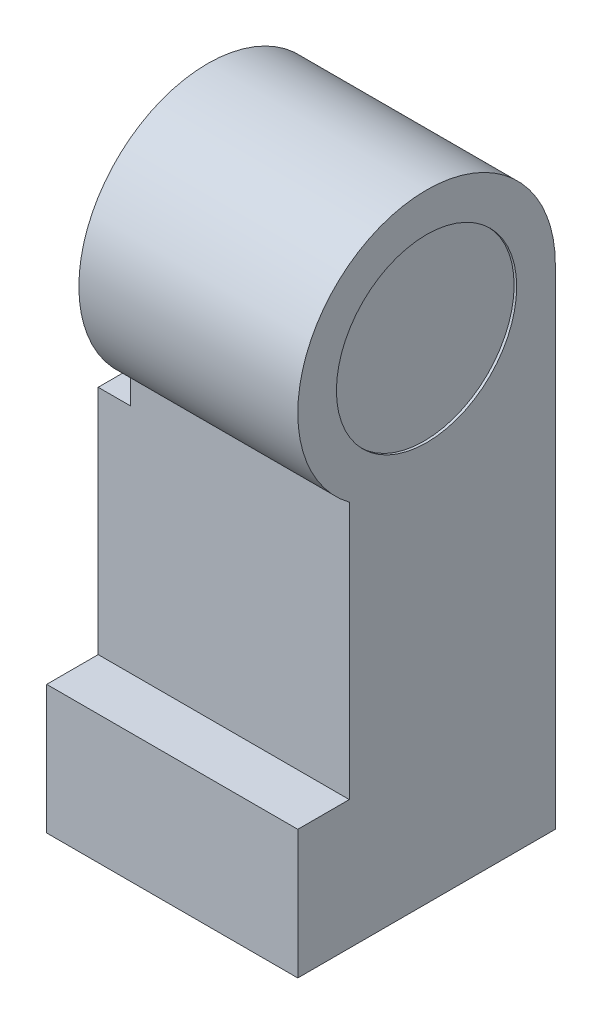
ISO-10303-21;
HEADER;
FILE_DESCRIPTION(('STEP AP214'),'2;1');
FILE_NAME('part.step','',(''),(''),'','','');
FILE_SCHEMA(('AUTOMOTIVE_DESIGN { 1 0 10303 214 1 1 1 1 }'));
ENDSEC;
DATA;
#1=APPLICATION_CONTEXT('core data for automotive mechanical design processes');
#2=APPLICATION_PROTOCOL_DEFINITION('international standard','automotive_design',2000,#1);
#3=PRODUCT_CONTEXT('',#1,'mechanical');
#4=PRODUCT('Part','Part','',(#3));
#5=PRODUCT_RELATED_PRODUCT_CATEGORY('part','',(#4));
#6=PRODUCT_DEFINITION_FORMATION('','',#4);
#7=PRODUCT_DEFINITION_CONTEXT('part definition',#1,'design');
#8=PRODUCT_DEFINITION('design','',#6,#7);
#9=PRODUCT_DEFINITION_SHAPE('','',#8);
#10=(LENGTH_UNIT() NAMED_UNIT(*) SI_UNIT(.MILLI.,.METRE.));
#11=(NAMED_UNIT(*) PLANE_ANGLE_UNIT() SI_UNIT($,.RADIAN.));
#12=(NAMED_UNIT(*) SI_UNIT($,.STERADIAN.) SOLID_ANGLE_UNIT());
#13=UNCERTAINTY_MEASURE_WITH_UNIT(LENGTH_MEASURE(1.E-05),#10,'distance_accuracy_value','');
#14=(GEOMETRIC_REPRESENTATION_CONTEXT(3) GLOBAL_UNCERTAINTY_ASSIGNED_CONTEXT((#13)) GLOBAL_UNIT_ASSIGNED_CONTEXT((#10,
#11,#12)) REPRESENTATION_CONTEXT('',''));
#15=CARTESIAN_POINT('',(0.,0.,0.));
#16=DIRECTION('',(0.,0.,1.));
#17=DIRECTION('',(1.,0.,0.));
#18=AXIS2_PLACEMENT_3D('',#15,#16,#17);
#19=CARTESIAN_POINT('',(-5.40048653563176,-1.49615044863682,-4.47761072313333));
#20=DIRECTION('',(0.,-1.,0.));
#21=DIRECTION('',(0.,0.,-1.));
#22=AXIS2_PLACEMENT_3D('',#19,#20,#21);
#23=PLANE('',#22);
#24=DIRECTION('',(0.,0.,-1.));
#25=VECTOR('',#24,1.);
#26=CARTESIAN_POINT('',(-4.90048653563176,-1.49615044863682,-4.47761072313333));
#27=LINE('',#26,#25);
#28=CARTESIAN_POINT('',(-4.90048653563176,-1.49615044863682,15.5223892768667));
#29=VERTEX_POINT('',#28);
#30=CARTESIAN_POINT('',(-4.90048653563176,-1.49615044863681,11.5223892768667));
#31=VERTEX_POINT('',#30);
#32=EDGE_CURVE('E194',#29,#31,#27,.T.);
#33=ORIENTED_EDGE('',*,*,#32,.F.);
#34=DIRECTION('',(1.,0.,0.));
#35=VECTOR('',#34,1.);
#36=CARTESIAN_POINT('',(-5.40048653563176,-1.49615044863682,15.5223892768667));
#37=LINE('',#36,#35);
#38=CARTESIAN_POINT('',(14.5995134643682,-1.49615044863682,15.5223892768667));
#39=VERTEX_POINT('',#38);
#40=EDGE_CURVE('E177',#29,#39,#37,.T.);
#41=ORIENTED_EDGE('',*,*,#40,.T.);
#42=DIRECTION('',(0.,0.,-1.));
#43=VECTOR('',#42,1.);
#44=CARTESIAN_POINT('',(14.5995134643682,-1.49615044863682,15.5223892768667));
#45=LINE('',#44,#43);
#46=CARTESIAN_POINT('',(14.5995134643682,-1.49615044863682,11.5223892768667));
#47=VERTEX_POINT('',#46);
#48=EDGE_CURVE('E168',#39,#47,#45,.T.);
#49=ORIENTED_EDGE('',*,*,#48,.T.);
#50=DIRECTION('',(1.,0.,0.));
#51=VECTOR('',#50,1.);
#52=CARTESIAN_POINT('',(-5.40048653563176,-1.49615044863682,11.5223892768667));
#53=LINE('',#52,#51);
#54=EDGE_CURVE('E41',#31,#47,#53,.T.);
#55=ORIENTED_EDGE('',*,*,#54,.F.);
#56=EDGE_LOOP('',(#33,#41,#49,#55));
#57=FACE_BOUND('',#56,.T.);
#58=ADVANCED_FACE('F37',(#57),#23,.F.);
#59=CARTESIAN_POINT('',(-5.40048653563176,-1.49615044863682,-4.47761072313333));
#60=DIRECTION('',(0.,0.,1.));
#61=DIRECTION('',(1.,0.,0.));
#62=AXIS2_PLACEMENT_3D('',#59,#60,#61);
#63=PLANE('',#62);
#64=DIRECTION('',(0.,-1.,0.));
#65=VECTOR('',#64,1.);
#66=CARTESIAN_POINT('',(-4.90048653563176,-11.4961504486368,-4.47761072313333));
#67=LINE('',#66,#65);
#68=CARTESIAN_POINT('',(-4.90048653563176,20.7072528486993,-4.47761072313333));
#69=VERTEX_POINT('',#68);
#70=CARTESIAN_POINT('',(-4.90048653563176,-11.4961504486368,-4.47761072313333));
#71=VERTEX_POINT('',#70);
#72=EDGE_CURVE('E143',#69,#71,#67,.T.);
#73=ORIENTED_EDGE('',*,*,#72,.F.);
#74=DIRECTION('',(-1.,0.,0.));
#75=VECTOR('',#74,1.);
#76=CARTESIAN_POINT('',(-2.40048653563176,20.7072528486993,-4.47761072313333));
#77=LINE('',#76,#75);
#78=CARTESIAN_POINT('',(-2.40048653563176,20.7072528486993,-4.47761072313333));
#79=VERTEX_POINT('',#78);
#80=EDGE_CURVE('E243',#79,#69,#77,.T.);
#81=ORIENTED_EDGE('',*,*,#80,.F.);
#82=DIRECTION('',(0.,-1.,0.));
#83=VECTOR('',#82,1.);
#84=CARTESIAN_POINT('',(-2.40048653563176,20.7072528486993,-4.47761072313333));
#85=LINE('',#84,#83);
#86=CARTESIAN_POINT('',(-2.40048653563176,26.5038495513632,-4.47761072313333));
#87=VERTEX_POINT('',#86);
#88=EDGE_CURVE('E230',#87,#79,#85,.T.);
#89=ORIENTED_EDGE('',*,*,#88,.F.);
#90=DIRECTION('',(-1.,0.,0.));
#91=VECTOR('',#90,1.);
#92=CARTESIAN_POINT('',(-5.40048653563176,26.5038495513632,-4.47761072313333));
#93=LINE('',#92,#91);
#94=CARTESIAN_POINT('',(14.5995134643682,26.5038495513632,-4.47761072313333));
#95=VERTEX_POINT('',#94);
#96=EDGE_CURVE('E205',#95,#87,#93,.T.);
#97=ORIENTED_EDGE('',*,*,#96,.F.);
#98=DIRECTION('',(0.,-1.,0.));
#99=VECTOR('',#98,1.);
#100=CARTESIAN_POINT('',(14.5995134643682,-1.49615044863682,-4.47761072313333));
#101=LINE('',#100,#99);
#102=CARTESIAN_POINT('',(14.5995134643682,-11.4961504486368,-4.47761072313333));
#103=VERTEX_POINT('',#102);
#104=EDGE_CURVE('E164',#95,#103,#101,.T.);
#105=ORIENTED_EDGE('',*,*,#104,.T.);
#106=DIRECTION('',(-1.,0.,0.));
#107=VECTOR('',#106,1.);
#108=CARTESIAN_POINT('',(-5.40048653563176,-11.4961504486368,-4.47761072313333));
#109=LINE('',#108,#107);
#110=EDGE_CURVE('E158',#103,#71,#109,.T.);
#111=ORIENTED_EDGE('',*,*,#110,.T.);
#112=EDGE_LOOP('',(#73,#81,#89,#97,#105,#111));
#113=FACE_BOUND('',#112,.T.);
#114=ADVANCED_FACE('F162',(#113),#63,.F.);
#115=CARTESIAN_POINT('',(-5.40048653563176,-1.49615044863682,15.5223892768667));
#116=DIRECTION('',(0.,0.,-1.));
#117=DIRECTION('',(-1.,0.,0.));
#118=AXIS2_PLACEMENT_3D('',#115,#116,#117);
#119=PLANE('',#118);
#120=DIRECTION('',(0.,1.,0.));
#121=VECTOR('',#120,1.);
#122=CARTESIAN_POINT('',(-4.90048653563176,-11.4961504486368,15.5223892768667));
#123=LINE('',#122,#121);
#124=CARTESIAN_POINT('',(-4.90048653563176,-11.4961504486368,15.5223892768667));
#125=VERTEX_POINT('',#124);
#126=EDGE_CURVE('E152',#125,#29,#123,.T.);
#127=ORIENTED_EDGE('',*,*,#126,.F.);
#128=DIRECTION('',(1.,0.,0.));
#129=VECTOR('',#128,1.);
#130=CARTESIAN_POINT('',(-5.40048653563176,-11.4961504486368,15.5223892768667));
#131=LINE('',#130,#129);
#132=CARTESIAN_POINT('',(14.5995134643682,-11.4961504486368,15.5223892768667));
#133=VERTEX_POINT('',#132);
#134=EDGE_CURVE('E160',#125,#133,#131,.T.);
#135=ORIENTED_EDGE('',*,*,#134,.T.);
#136=DIRECTION('',(0.,-1.,0.));
#137=VECTOR('',#136,1.);
#138=CARTESIAN_POINT('',(14.5995134643682,-1.49615044863682,15.5223892768667));
#139=LINE('',#138,#137);
#140=EDGE_CURVE('E174',#39,#133,#139,.T.);
#141=ORIENTED_EDGE('',*,*,#140,.F.);
#142=ORIENTED_EDGE('',*,*,#40,.F.);
#143=EDGE_LOOP('',(#127,#135,#141,#142));
#144=FACE_BOUND('',#143,.T.);
#145=ADVANCED_FACE('F196',(#144),#119,.F.);
#146=CARTESIAN_POINT('',(-5.40048653563176,-11.4961504486368,-4.47761072313333));
#147=DIRECTION('',(0.,-1.,0.));
#148=DIRECTION('',(0.,0.,-1.));
#149=AXIS2_PLACEMENT_3D('',#146,#147,#148);
#150=PLANE('',#149);
#151=DIRECTION('',(0.,0.,-1.));
#152=VECTOR('',#151,1.);
#153=CARTESIAN_POINT('',(-1.40048653563176,-11.4961504486368,11.5223892768667));
#154=LINE('',#153,#152);
#155=CARTESIAN_POINT('',(-1.40048653563176,-11.4961504486368,11.5223892768667));
#156=VERTEX_POINT('',#155);
#157=CARTESIAN_POINT('',(-1.40048653563176,-11.4961504486368,-0.477610723133327));
#158=VERTEX_POINT('',#157);
#159=EDGE_CURVE('E61',#156,#158,#154,.T.);
#160=ORIENTED_EDGE('',*,*,#159,.F.);
#161=DIRECTION('',(-1.,0.,0.));
#162=VECTOR('',#161,1.);
#163=CARTESIAN_POINT('',(-1.40048653563176,-11.4961504486368,11.5223892768667));
#164=LINE('',#163,#162);
#165=CARTESIAN_POINT('',(10.5995134643682,-11.4961504486368,11.5223892768667));
#166=VERTEX_POINT('',#165);
#167=EDGE_CURVE('E278',#166,#156,#164,.T.);
#168=ORIENTED_EDGE('',*,*,#167,.F.);
#169=DIRECTION('',(0.,0.,1.));
#170=VECTOR('',#169,1.);
#171=CARTESIAN_POINT('',(10.5995134643682,-11.4961504486368,11.5223892768667));
#172=LINE('',#171,#170);
#173=CARTESIAN_POINT('',(10.5995134643682,-11.4961504486368,-0.477610723133327));
#174=VERTEX_POINT('',#173);
#175=EDGE_CURVE('E292',#174,#166,#172,.T.);
#176=ORIENTED_EDGE('',*,*,#175,.F.);
#177=DIRECTION('',(1.,0.,0.));
#178=VECTOR('',#177,1.);
#179=CARTESIAN_POINT('',(-1.40048653563176,-11.4961504486368,-0.477610723133327));
#180=LINE('',#179,#178);
#181=EDGE_CURVE('E289',#158,#174,#180,.T.);
#182=ORIENTED_EDGE('',*,*,#181,.F.);
#183=EDGE_LOOP('',(#160,#168,#176,#182));
#184=FACE_BOUND('',#183,.T.);
#185=ORIENTED_EDGE('',*,*,#134,.F.);
#186=DIRECTION('',(0.,0.,1.));
#187=VECTOR('',#186,1.);
#188=CARTESIAN_POINT('',(-4.90048653563176,-11.4961504486368,15.5223892768667));
#189=LINE('',#188,#187);
#190=EDGE_CURVE('E146',#71,#125,#189,.T.);
#191=ORIENTED_EDGE('',*,*,#190,.F.);
#192=ORIENTED_EDGE('',*,*,#110,.F.);
#193=DIRECTION('',(0.,0.,-1.));
#194=VECTOR('',#193,1.);
#195=CARTESIAN_POINT('',(14.5995134643682,-11.4961504486368,15.5223892768667));
#196=LINE('',#195,#194);
#197=EDGE_CURVE('E166',#133,#103,#196,.T.);
#198=ORIENTED_EDGE('',*,*,#197,.F.);
#199=EDGE_LOOP('',(#185,#191,#192,#198));
#200=FACE_BOUND('',#199,.T.);
#201=ADVANCED_FACE('F156',(#184,#200),#150,.T.);
#202=CARTESIAN_POINT('',(-5.40048653563176,26.5038495513632,11.5223892768667));
#203=DIRECTION('',(0.,0.,-1.));
#204=DIRECTION('',(-1.,0.,0.));
#205=AXIS2_PLACEMENT_3D('',#202,#203,#204);
#206=PLANE('',#205);
#207=DIRECTION('',(0.,1.,0.));
#208=VECTOR('',#207,1.);
#209=CARTESIAN_POINT('',(-4.90048653563176,26.5038495513632,11.5223892768667));
#210=LINE('',#209,#208);
#211=CARTESIAN_POINT('',(-4.90048653563176,16.4838495513632,11.5223892768667));
#212=VERTEX_POINT('',#211);
#213=EDGE_CURVE('E213',#31,#212,#210,.T.);
#214=ORIENTED_EDGE('',*,*,#213,.F.);
#215=ORIENTED_EDGE('',*,*,#54,.T.);
#216=DIRECTION('',(0.,-1.,0.));
#217=VECTOR('',#216,1.);
#218=CARTESIAN_POINT('',(14.5995134643682,26.5038495513632,11.5223892768667));
#219=LINE('',#218,#217);
#220=CARTESIAN_POINT('',(14.5995134643682,18.5038495513632,11.5223892768667));
#221=VERTEX_POINT('',#220);
#222=EDGE_CURVE('E170',#221,#47,#219,.T.);
#223=ORIENTED_EDGE('',*,*,#222,.F.);
#224=DIRECTION('',(-1.,0.,0.));
#225=VECTOR('',#224,1.);
#226=CARTESIAN_POINT('',(14.5995134643682,18.5038495513632,11.5223892768667));
#227=LINE('',#226,#225);
#228=CARTESIAN_POINT('',(-2.40048653563176,18.5038495513632,11.5223892768667));
#229=VERTEX_POINT('',#228);
#230=EDGE_CURVE('E254',#221,#229,#227,.T.);
#231=ORIENTED_EDGE('',*,*,#230,.T.);
#232=DIRECTION('',(0.,-1.,0.));
#233=VECTOR('',#232,1.);
#234=CARTESIAN_POINT('',(-2.40048653563176,26.5038495513632,11.5223892768667));
#235=LINE('',#234,#233);
#236=CARTESIAN_POINT('',(-2.40048653563176,16.4838495513632,11.5223892768667));
#237=VERTEX_POINT('',#236);
#238=EDGE_CURVE('E215',#229,#237,#235,.T.);
#239=ORIENTED_EDGE('',*,*,#238,.T.);
#240=DIRECTION('',(-1.,0.,0.));
#241=VECTOR('',#240,1.);
#242=CARTESIAN_POINT('',(-5.40048653563176,16.4838495513632,11.5223892768667));
#243=LINE('',#242,#241);
#244=EDGE_CURVE('E47',#237,#212,#243,.T.);
#245=ORIENTED_EDGE('',*,*,#244,.T.);
#246=EDGE_LOOP('',(#214,#215,#223,#231,#239,#245));
#247=FACE_BOUND('',#246,.T.);
#248=ADVANCED_FACE('F212',(#247),#206,.F.);
#249=CARTESIAN_POINT('',(-2.40048653563176,16.4838495513632,5.52238927686668));
#250=DIRECTION('',(0.,-1.,0.));
#251=DIRECTION('',(0.,0.,-1.));
#252=AXIS2_PLACEMENT_3D('',#249,#250,#251);
#253=PLANE('',#252);
#254=DIRECTION('',(0.,0.,-1.));
#255=VECTOR('',#254,1.);
#256=CARTESIAN_POINT('',(-4.90048653563176,16.4838495513632,5.52238927686668));
#257=LINE('',#256,#255);
#258=CARTESIAN_POINT('',(-4.90048653563176,16.4838495513632,5.52238927686668));
#259=VERTEX_POINT('',#258);
#260=EDGE_CURVE('E224',#212,#259,#257,.T.);
#261=ORIENTED_EDGE('',*,*,#260,.F.);
#262=ORIENTED_EDGE('',*,*,#244,.F.);
#263=DIRECTION('',(0.,0.,1.));
#264=VECTOR('',#263,1.);
#265=CARTESIAN_POINT('',(-2.40048653563176,16.4838495513632,5.52238927686668));
#266=LINE('',#265,#264);
#267=CARTESIAN_POINT('',(-2.40048653563176,16.4838495513632,5.52238927686668));
#268=VERTEX_POINT('',#267);
#269=EDGE_CURVE('E222',#268,#237,#266,.T.);
#270=ORIENTED_EDGE('',*,*,#269,.F.);
#271=DIRECTION('',(-1.,0.,0.));
#272=VECTOR('',#271,1.);
#273=CARTESIAN_POINT('',(-2.40048653563176,16.4838495513632,5.52238927686668));
#274=LINE('',#273,#272);
#275=EDGE_CURVE('E239',#268,#259,#274,.T.);
#276=ORIENTED_EDGE('',*,*,#275,.T.);
#277=EDGE_LOOP('',(#261,#262,#270,#276));
#278=FACE_BOUND('',#277,.T.);
#279=ADVANCED_FACE('F220',(#278),#253,.F.);
#280=CARTESIAN_POINT('',(-2.40048653563176,26.5038495513632,5.52238927686667));
#281=DIRECTION('',(-1.,0.,0.));
#282=DIRECTION('',(0.,0.,1.));
#283=AXIS2_PLACEMENT_3D('',#280,#281,#282);
#284=CYLINDRICAL_SURFACE('',#283,10.02);
#285=CARTESIAN_POINT('',(-4.90048653563176,26.5038495513632,5.52238927686667));
#286=DIRECTION('',(-1.,0.,0.));
#287=DIRECTION('',(0.,0.,1.));
#288=AXIS2_PLACEMENT_3D('',#285,#286,#287);
#289=CIRCLE('',#288,10.02);
#290=CARTESIAN_POINT('',(-4.90048653563176,17.8262750054431,0.512389276866731));
#291=VERTEX_POINT('',#290);
#292=EDGE_CURVE('E53',#259,#291,#289,.F.);
#293=ORIENTED_EDGE('',*,*,#292,.F.);
#294=ORIENTED_EDGE('',*,*,#275,.F.);
#295=CARTESIAN_POINT('',(-2.40048653563176,26.5038495513632,5.52238927686667));
#296=DIRECTION('',(-1.,0.,0.));
#297=DIRECTION('',(0.,0.,-1.));
#298=AXIS2_PLACEMENT_3D('',#295,#296,#297);
#299=CIRCLE('',#298,10.02);
#300=CARTESIAN_POINT('',(-2.40048653563176,17.8262750054431,0.51238927686673));
#301=VERTEX_POINT('',#300);
#302=EDGE_CURVE('E229',#301,#268,#299,.T.);
#303=ORIENTED_EDGE('',*,*,#302,.F.);
#304=DIRECTION('',(-1.,0.,0.));
#305=VECTOR('',#304,1.);
#306=CARTESIAN_POINT('',(-2.40048653563176,17.8262750054431,0.51238927686673));
#307=LINE('',#306,#305);
#308=EDGE_CURVE('E240',#301,#291,#307,.T.);
#309=ORIENTED_EDGE('',*,*,#308,.T.);
#310=EDGE_LOOP('',(#293,#294,#303,#309));
#311=FACE_BOUND('',#310,.T.);
#312=ADVANCED_FACE('F262',(#311),#284,.F.);
#313=CARTESIAN_POINT('',(-2.40048653563176,17.8262750054431,0.51238927686673));
#314=DIRECTION('',(0.,-0.866025403784442,-0.499999999999994));
#315=DIRECTION('',(0.,0.499999999999994,-0.866025403784442));
#316=AXIS2_PLACEMENT_3D('',#313,#314,#315);
#317=PLANE('',#316);
#318=DIRECTION('',(0.,0.499999999999994,-0.866025403784442));
#319=VECTOR('',#318,1.);
#320=CARTESIAN_POINT('',(-4.90048653563176,17.8262750054431,0.51238927686673));
#321=LINE('',#320,#319);
#322=EDGE_CURVE('E11',#291,#69,#321,.T.);
#323=ORIENTED_EDGE('',*,*,#322,.F.);
#324=ORIENTED_EDGE('',*,*,#308,.F.);
#325=DIRECTION('',(0.,-0.499999999999994,0.866025403784442));
#326=VECTOR('',#325,1.);
#327=CARTESIAN_POINT('',(-2.40048653563176,17.8262750054431,0.51238927686673));
#328=LINE('',#327,#326);
#329=EDGE_CURVE('E232',#79,#301,#328,.T.);
#330=ORIENTED_EDGE('',*,*,#329,.F.);
#331=ORIENTED_EDGE('',*,*,#80,.T.);
#332=EDGE_LOOP('',(#323,#324,#330,#331));
#333=FACE_BOUND('',#332,.T.);
#334=ADVANCED_FACE('F260',(#333),#317,.F.);
#335=CARTESIAN_POINT('',(14.5995134643682,-1.49615044863682,15.5223892768667));
#336=DIRECTION('',(-1.,0.,0.));
#337=DIRECTION('',(0.,0.,1.));
#338=AXIS2_PLACEMENT_3D('',#335,#336,#337);
#339=PLANE('',#338);
#340=CARTESIAN_POINT('',(14.5995134643682,26.5038495513632,5.52238927686667));
#341=DIRECTION('',(1.,0.,0.));
#342=DIRECTION('',(0.,0.,-1.));
#343=AXIS2_PLACEMENT_3D('',#340,#341,#342);
#344=CIRCLE('',#343,7.);
#345=CARTESIAN_POINT('',(14.5995134643682,26.5038495513632,-1.47761072313332));
#346=VERTEX_POINT('',#345);
#347=EDGE_CURVE('E247',#346,#346,#344,.T.);
#348=ORIENTED_EDGE('',*,*,#347,.F.);
#349=EDGE_LOOP('',(#348));
#350=FACE_BOUND('',#349,.T.);
#351=ORIENTED_EDGE('',*,*,#104,.F.);
#352=CARTESIAN_POINT('',(14.5995134643682,26.5038495513632,5.52238927686667));
#353=DIRECTION('',(-1.,0.,0.));
#354=DIRECTION('',(0.,0.,1.));
#355=AXIS2_PLACEMENT_3D('',#352,#353,#354);
#356=CIRCLE('',#355,10.);
#357=EDGE_CURVE('E201',#221,#95,#356,.T.);
#358=ORIENTED_EDGE('',*,*,#357,.F.);
#359=ORIENTED_EDGE('',*,*,#222,.T.);
#360=ORIENTED_EDGE('',*,*,#48,.F.);
#361=ORIENTED_EDGE('',*,*,#140,.T.);
#362=ORIENTED_EDGE('',*,*,#197,.T.);
#363=EDGE_LOOP('',(#351,#358,#359,#360,#361,#362));
#364=FACE_BOUND('',#363,.T.);
#365=ADVANCED_FACE('F39',(#350,#364),#339,.F.);
#366=CARTESIAN_POINT('',(14.5995134643682,26.5038495513632,5.52238927686667));
#367=DIRECTION('',(-1.,0.,0.));
#368=DIRECTION('',(0.,0.,1.));
#369=AXIS2_PLACEMENT_3D('',#366,#367,#368);
#370=CYLINDRICAL_SURFACE('',#369,10.);
#371=CARTESIAN_POINT('',(-2.40048653563176,26.5038495513632,5.52238927686667));
#372=DIRECTION('',(1.,0.,0.));
#373=DIRECTION('',(0.,0.,-1.));
#374=AXIS2_PLACEMENT_3D('',#371,#372,#373);
#375=CIRCLE('',#374,10.);
#376=EDGE_CURVE('E179',#229,#87,#375,.F.);
#377=ORIENTED_EDGE('',*,*,#376,.F.);
#378=ORIENTED_EDGE('',*,*,#230,.F.);
#379=ORIENTED_EDGE('',*,*,#357,.T.);
#380=ORIENTED_EDGE('',*,*,#96,.T.);
#381=EDGE_LOOP('',(#377,#378,#379,#380));
#382=FACE_BOUND('',#381,.T.);
#383=ADVANCED_FACE('F256',(#382),#370,.T.);
#384=CARTESIAN_POINT('',(14.3995134643682,26.5038495513632,5.52238927686667));
#385=DIRECTION('',(1.,0.,0.));
#386=DIRECTION('',(0.,0.,-1.));
#387=AXIS2_PLACEMENT_3D('',#384,#385,#386);
#388=CYLINDRICAL_SURFACE('',#387,7.);
#389=CARTESIAN_POINT('',(14.3995134643682,26.5038495513632,5.52238927686667));
#390=DIRECTION('',(1.,0.,0.));
#391=DIRECTION('',(0.,0.,-1.));
#392=AXIS2_PLACEMENT_3D('',#389,#390,#391);
#393=CIRCLE('',#392,7.);
#394=CARTESIAN_POINT('',(14.3995134643682,26.5038495513632,-1.47761072313332));
#395=VERTEX_POINT('',#394);
#396=EDGE_CURVE('E248',#395,#395,#393,.T.);
#397=ORIENTED_EDGE('',*,*,#396,.F.);
#398=EDGE_LOOP('',(#397));
#399=FACE_BOUND('',#398,.T.);
#400=ORIENTED_EDGE('',*,*,#347,.T.);
#401=EDGE_LOOP('',(#400));
#402=FACE_BOUND('',#401,.T.);
#403=ADVANCED_FACE('F327',(#399,#402),#388,.F.);
#404=CARTESIAN_POINT('',(14.3995134643682,26.5038495513632,5.52238927686667));
#405=DIRECTION('',(1.,0.,0.));
#406=DIRECTION('',(0.,0.,-1.));
#407=AXIS2_PLACEMENT_3D('',#404,#405,#406);
#408=PLANE('',#407);
#409=ORIENTED_EDGE('',*,*,#396,.T.);
#410=EDGE_LOOP('',(#409));
#411=FACE_BOUND('',#410,.T.);
#412=ADVANCED_FACE('F319',(#411),#408,.T.);
#413=CARTESIAN_POINT('',(-2.40048653563176,26.5038495513632,5.52238927686667));
#414=DIRECTION('',(1.,0.,0.));
#415=DIRECTION('',(0.,0.,-1.));
#416=AXIS2_PLACEMENT_3D('',#413,#414,#415);
#417=PLANE('',#416);
#418=CARTESIAN_POINT('',(-2.40048653563176,26.5038495513632,5.52238927686667));
#419=DIRECTION('',(-1.,0.,0.));
#420=DIRECTION('',(0.,0.,1.));
#421=AXIS2_PLACEMENT_3D('',#418,#419,#420);
#422=CIRCLE('',#421,4.);
#423=CARTESIAN_POINT('',(-2.40048653563176,26.5038495513632,9.52238927686667));
#424=VERTEX_POINT('',#423);
#425=EDGE_CURVE('E299',#424,#424,#422,.T.);
#426=ORIENTED_EDGE('',*,*,#425,.F.);
#427=EDGE_LOOP('',(#426));
#428=FACE_BOUND('',#427,.T.);
#429=ORIENTED_EDGE('',*,*,#238,.F.);
#430=ORIENTED_EDGE('',*,*,#376,.T.);
#431=ORIENTED_EDGE('',*,*,#88,.T.);
#432=ORIENTED_EDGE('',*,*,#329,.T.);
#433=ORIENTED_EDGE('',*,*,#302,.T.);
#434=ORIENTED_EDGE('',*,*,#269,.T.);
#435=EDGE_LOOP('',(#429,#430,#431,#432,#433,#434));
#436=FACE_BOUND('',#435,.T.);
#437=ADVANCED_FACE('F226',(#428,#436),#417,.F.);
#438=CARTESIAN_POINT('',(9.59951346436824,26.5038495513632,5.52238927686667));
#439=DIRECTION('',(-1.,0.,0.));
#440=DIRECTION('',(0.,0.,1.));
#441=AXIS2_PLACEMENT_3D('',#438,#439,#440);
#442=CONICAL_SURFACE('',#441,4.,1.02974425867665);
#443=CARTESIAN_POINT('',(12.0029559404785,26.5038495513632,5.52238927686667));
#444=VERTEX_POINT('',#443);
#445=VERTEX_LOOP('',#444);
#446=FACE_BOUND('',#445,.T.);
#447=CARTESIAN_POINT('',(9.59951346436824,26.5038495513632,5.52238927686667));
#448=DIRECTION('',(-1.,0.,0.));
#449=DIRECTION('',(0.,0.,1.));
#450=AXIS2_PLACEMENT_3D('',#447,#448,#449);
#451=CIRCLE('',#450,4.);
#452=CARTESIAN_POINT('',(9.59951346436824,26.5038495513632,9.52238927686667));
#453=VERTEX_POINT('',#452);
#454=EDGE_CURVE('E234',#453,#453,#451,.T.);
#455=ORIENTED_EDGE('',*,*,#454,.T.);
#456=EDGE_LOOP('',(#455));
#457=FACE_BOUND('',#456,.T.);
#458=ADVANCED_FACE('F309',(#446,#457),#442,.F.);
#459=CARTESIAN_POINT('',(-2.40048653563176,26.5038495513632,5.52238927686667));
#460=DIRECTION('',(-1.,0.,0.));
#461=DIRECTION('',(0.,0.,1.));
#462=AXIS2_PLACEMENT_3D('',#459,#460,#461);
#463=CYLINDRICAL_SURFACE('',#462,4.);
#464=ORIENTED_EDGE('',*,*,#454,.F.);
#465=EDGE_LOOP('',(#464));
#466=FACE_BOUND('',#465,.T.);
#467=ORIENTED_EDGE('',*,*,#425,.T.);
#468=EDGE_LOOP('',(#467));
#469=FACE_BOUND('',#468,.T.);
#470=ADVANCED_FACE('F311',(#466,#469),#463,.F.);
#471=CARTESIAN_POINT('',(-1.40048653563176,-6.49615044863681,11.5223892768667));
#472=DIRECTION('',(-1.,0.,0.));
#473=DIRECTION('',(0.,0.,1.));
#474=AXIS2_PLACEMENT_3D('',#471,#472,#473);
#475=PLANE('',#474);
#476=ORIENTED_EDGE('',*,*,#159,.T.);
#477=DIRECTION('',(0.,-1.,0.));
#478=VECTOR('',#477,1.);
#479=CARTESIAN_POINT('',(-1.40048653563176,-6.49615044863681,-0.477610723133327));
#480=LINE('',#479,#478);
#481=CARTESIAN_POINT('',(-1.40048653563176,-6.49615044863681,-0.477610723133327));
#482=VERTEX_POINT('',#481);
#483=EDGE_CURVE('E287',#482,#158,#480,.T.);
#484=ORIENTED_EDGE('',*,*,#483,.F.);
#485=DIRECTION('',(0.,0.,-1.));
#486=VECTOR('',#485,1.);
#487=CARTESIAN_POINT('',(-1.40048653563176,-6.49615044863681,11.5223892768667));
#488=LINE('',#487,#486);
#489=CARTESIAN_POINT('',(-1.40048653563176,-6.49615044863681,11.5223892768667));
#490=VERTEX_POINT('',#489);
#491=EDGE_CURVE('E274',#490,#482,#488,.T.);
#492=ORIENTED_EDGE('',*,*,#491,.F.);
#493=DIRECTION('',(0.,-1.,0.));
#494=VECTOR('',#493,1.);
#495=CARTESIAN_POINT('',(-1.40048653563176,-6.49615044863681,11.5223892768667));
#496=LINE('',#495,#494);
#497=EDGE_CURVE('E297',#490,#156,#496,.T.);
#498=ORIENTED_EDGE('',*,*,#497,.T.);
#499=EDGE_LOOP('',(#476,#484,#492,#498));
#500=FACE_BOUND('',#499,.T.);
#501=ADVANCED_FACE('F314',(#500),#475,.F.);
#502=CARTESIAN_POINT('',(-1.40048653563176,-6.49615044863681,11.5223892768667));
#503=DIRECTION('',(0.,0.,1.));
#504=DIRECTION('',(1.,0.,0.));
#505=AXIS2_PLACEMENT_3D('',#502,#503,#504);
#506=PLANE('',#505);
#507=ORIENTED_EDGE('',*,*,#167,.T.);
#508=ORIENTED_EDGE('',*,*,#497,.F.);
#509=DIRECTION('',(-1.,0.,0.));
#510=VECTOR('',#509,1.);
#511=CARTESIAN_POINT('',(-1.40048653563176,-6.49615044863681,11.5223892768667));
#512=LINE('',#511,#510);
#513=CARTESIAN_POINT('',(10.5995134643682,-6.49615044863681,11.5223892768667));
#514=VERTEX_POINT('',#513);
#515=EDGE_CURVE('E284',#514,#490,#512,.T.);
#516=ORIENTED_EDGE('',*,*,#515,.F.);
#517=DIRECTION('',(0.,-1.,0.));
#518=VECTOR('',#517,1.);
#519=CARTESIAN_POINT('',(10.5995134643682,-6.49615044863681,11.5223892768667));
#520=LINE('',#519,#518);
#521=EDGE_CURVE('E300',#514,#166,#520,.T.);
#522=ORIENTED_EDGE('',*,*,#521,.T.);
#523=EDGE_LOOP('',(#507,#508,#516,#522));
#524=FACE_BOUND('',#523,.T.);
#525=ADVANCED_FACE('F420',(#524),#506,.F.);
#526=CARTESIAN_POINT('',(10.5995134643682,-6.49615044863681,11.5223892768667));
#527=DIRECTION('',(1.,0.,0.));
#528=DIRECTION('',(0.,0.,-1.));
#529=AXIS2_PLACEMENT_3D('',#526,#527,#528);
#530=PLANE('',#529);
#531=ORIENTED_EDGE('',*,*,#175,.T.);
#532=ORIENTED_EDGE('',*,*,#521,.F.);
#533=DIRECTION('',(0.,0.,1.));
#534=VECTOR('',#533,1.);
#535=CARTESIAN_POINT('',(10.5995134643682,-6.49615044863681,11.5223892768667));
#536=LINE('',#535,#534);
#537=CARTESIAN_POINT('',(10.5995134643682,-6.49615044863681,-0.477610723133327));
#538=VERTEX_POINT('',#537);
#539=EDGE_CURVE('E281',#538,#514,#536,.T.);
#540=ORIENTED_EDGE('',*,*,#539,.F.);
#541=DIRECTION('',(0.,-1.,0.));
#542=VECTOR('',#541,1.);
#543=CARTESIAN_POINT('',(10.5995134643682,-6.49615044863681,-0.477610723133327));
#544=LINE('',#543,#542);
#545=EDGE_CURVE('E302',#538,#174,#544,.T.);
#546=ORIENTED_EDGE('',*,*,#545,.T.);
#547=EDGE_LOOP('',(#531,#532,#540,#546));
#548=FACE_BOUND('',#547,.T.);
#549=ADVANCED_FACE('F429',(#548),#530,.F.);
#550=CARTESIAN_POINT('',(-1.40048653563176,-6.49615044863681,-0.477610723133327));
#551=DIRECTION('',(0.,0.,-1.));
#552=DIRECTION('',(-1.,0.,0.));
#553=AXIS2_PLACEMENT_3D('',#550,#551,#552);
#554=PLANE('',#553);
#555=ORIENTED_EDGE('',*,*,#181,.T.);
#556=ORIENTED_EDGE('',*,*,#545,.F.);
#557=DIRECTION('',(1.,0.,0.));
#558=VECTOR('',#557,1.);
#559=CARTESIAN_POINT('',(-1.40048653563176,-6.49615044863681,-0.477610723133327));
#560=LINE('',#559,#558);
#561=EDGE_CURVE('E277',#482,#538,#560,.T.);
#562=ORIENTED_EDGE('',*,*,#561,.F.);
#563=ORIENTED_EDGE('',*,*,#483,.T.);
#564=EDGE_LOOP('',(#555,#556,#562,#563));
#565=FACE_BOUND('',#564,.T.);
#566=ADVANCED_FACE('F439',(#565),#554,.F.);
#567=CARTESIAN_POINT('',(-5.40048653563176,-6.49615044863681,-4.47761072313333));
#568=DIRECTION('',(0.,-1.,0.));
#569=DIRECTION('',(0.,0.,-1.));
#570=AXIS2_PLACEMENT_3D('',#567,#568,#569);
#571=PLANE('',#570);
#572=CARTESIAN_POINT('',(4.59951346436824,-6.49615044863681,5.52238927686667));
#573=DIRECTION('',(0.,-1.,0.));
#574=DIRECTION('',(0.,0.,-1.));
#575=AXIS2_PLACEMENT_3D('',#572,#573,#574);
#576=CIRCLE('',#575,3.);
#577=CARTESIAN_POINT('',(4.59951346436824,-6.49615044863681,2.52238927686668));
#578=VERTEX_POINT('',#577);
#579=EDGE_CURVE('E268',#578,#578,#576,.T.);
#580=ORIENTED_EDGE('',*,*,#579,.F.);
#581=EDGE_LOOP('',(#580));
#582=FACE_BOUND('',#581,.T.);
#583=ORIENTED_EDGE('',*,*,#491,.T.);
#584=ORIENTED_EDGE('',*,*,#561,.T.);
#585=ORIENTED_EDGE('',*,*,#539,.T.);
#586=ORIENTED_EDGE('',*,*,#515,.T.);
#587=EDGE_LOOP('',(#583,#584,#585,#586));
#588=FACE_BOUND('',#587,.T.);
#589=ADVANCED_FACE('F449',(#582,#588),#571,.T.);
#590=CARTESIAN_POINT('',(4.59951346436824,9.50384955136319,5.52238927686667));
#591=DIRECTION('',(0.,-1.,0.));
#592=DIRECTION('',(0.,0.,-1.));
#593=AXIS2_PLACEMENT_3D('',#590,#591,#592);
#594=CONICAL_SURFACE('',#593,3.,1.02974425867665);
#595=CARTESIAN_POINT('',(4.59951346436824,11.3064314084459,5.52238927686667));
#596=VERTEX_POINT('',#595);
#597=VERTEX_LOOP('',#596);
#598=FACE_BOUND('',#597,.T.);
#599=CARTESIAN_POINT('',(4.59951346436824,9.50384955136319,5.52238927686667));
#600=DIRECTION('',(0.,-1.,0.));
#601=DIRECTION('',(0.,0.,-1.));
#602=AXIS2_PLACEMENT_3D('',#599,#600,#601);
#603=CIRCLE('',#602,3.);
#604=CARTESIAN_POINT('',(4.59951346436824,9.50384955136319,2.52238927686668));
#605=VERTEX_POINT('',#604);
#606=EDGE_CURVE('E271',#605,#605,#603,.T.);
#607=ORIENTED_EDGE('',*,*,#606,.T.);
#608=EDGE_LOOP('',(#607));
#609=FACE_BOUND('',#608,.T.);
#610=ADVANCED_FACE('F459',(#598,#609),#594,.F.);
#611=CARTESIAN_POINT('',(4.59951346436824,-6.49615044863681,5.52238927686667));
#612=DIRECTION('',(0.,-1.,0.));
#613=DIRECTION('',(0.,0.,-1.));
#614=AXIS2_PLACEMENT_3D('',#611,#612,#613);
#615=CYLINDRICAL_SURFACE('',#614,3.);
#616=ORIENTED_EDGE('',*,*,#606,.F.);
#617=EDGE_LOOP('',(#616));
#618=FACE_BOUND('',#617,.T.);
#619=ORIENTED_EDGE('',*,*,#579,.T.);
#620=EDGE_LOOP('',(#619));
#621=FACE_BOUND('',#620,.T.);
#622=ADVANCED_FACE('F469',(#618,#621),#615,.F.);
#623=CARTESIAN_POINT('',(-4.90048653563176,-11.4961504486368,-4.47761072313333));
#624=DIRECTION('',(-1.,0.,0.));
#625=DIRECTION('',(0.,0.,1.));
#626=AXIS2_PLACEMENT_3D('',#623,#624,#625);
#627=PLANE('',#626);
#628=ORIENTED_EDGE('',*,*,#32,.T.);
#629=ORIENTED_EDGE('',*,*,#213,.T.);
#630=ORIENTED_EDGE('',*,*,#260,.T.);
#631=ORIENTED_EDGE('',*,*,#292,.T.);
#632=ORIENTED_EDGE('',*,*,#322,.T.);
#633=ORIENTED_EDGE('',*,*,#72,.T.);
#634=ORIENTED_EDGE('',*,*,#190,.T.);
#635=ORIENTED_EDGE('',*,*,#126,.T.);
#636=EDGE_LOOP('',(#628,#629,#630,#631,#632,#633,#634,#635));
#637=FACE_BOUND('',#636,.T.);
#638=ADVANCED_FACE('F145',(#637),#627,.T.);
#639=CLOSED_SHELL('',(#58,#114,#145,#201,#248,#279,#312,#334,#365,#383,#403,#412,#437,#458,#470,
#501,#525,#549,#566,#589,#610,#622,#638));
#640=MANIFOLD_SOLID_BREP('B2',#639);
#641=ADVANCED_BREP_SHAPE_REPRESENTATION('',(#18,#640),#14);
#642=SHAPE_DEFINITION_REPRESENTATION(#9,#641);
ENDSEC;
END-ISO-10303-21;
